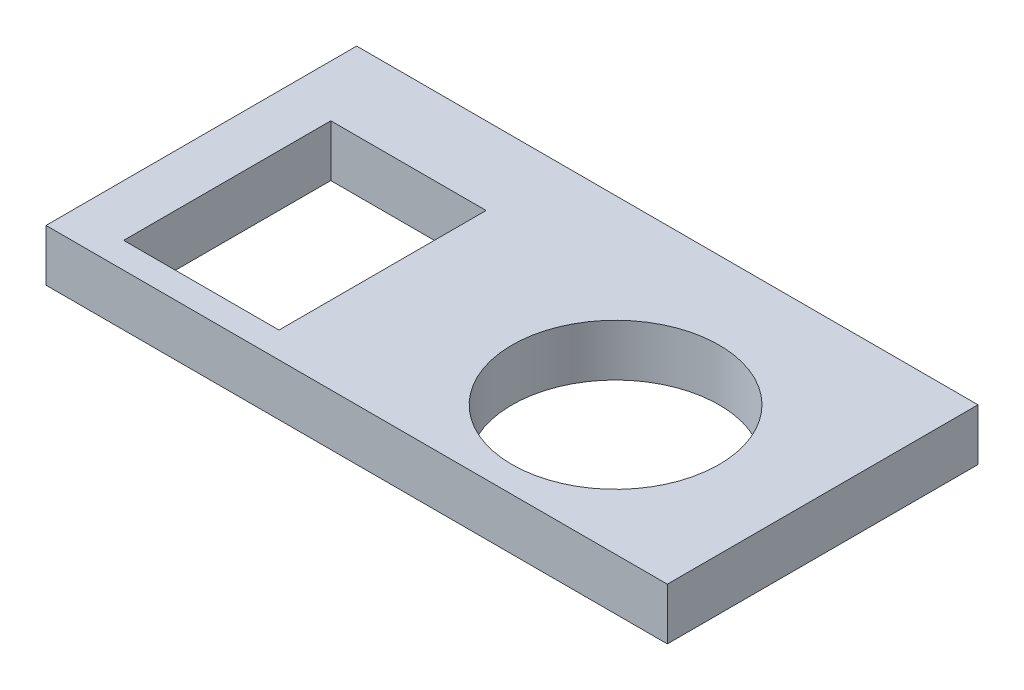
ISO-10303-21;
HEADER;
FILE_DESCRIPTION(('STEP AP214'),'2;1');
FILE_NAME('part.step','',(''),(''),'','','');
FILE_SCHEMA(('AUTOMOTIVE_DESIGN { 1 0 10303 214 1 1 1 1 }'));
ENDSEC;
DATA;
#1=APPLICATION_CONTEXT('core data for automotive mechanical design processes');
#2=APPLICATION_PROTOCOL_DEFINITION('international standard','automotive_design',2000,#1);
#3=PRODUCT_CONTEXT('',#1,'mechanical');
#4=PRODUCT('Part','Part','',(#3));
#5=PRODUCT_RELATED_PRODUCT_CATEGORY('part','',(#4));
#6=PRODUCT_DEFINITION_FORMATION('','',#4);
#7=PRODUCT_DEFINITION_CONTEXT('part definition',#1,'design');
#8=PRODUCT_DEFINITION('design','',#6,#7);
#9=PRODUCT_DEFINITION_SHAPE('','',#8);
#10=(LENGTH_UNIT() NAMED_UNIT(*) SI_UNIT(.MILLI.,.METRE.));
#11=(NAMED_UNIT(*) PLANE_ANGLE_UNIT() SI_UNIT($,.RADIAN.));
#12=(NAMED_UNIT(*) SI_UNIT($,.STERADIAN.) SOLID_ANGLE_UNIT());
#13=UNCERTAINTY_MEASURE_WITH_UNIT(LENGTH_MEASURE(1.E-05),#10,'distance_accuracy_value','');
#14=(GEOMETRIC_REPRESENTATION_CONTEXT(3) GLOBAL_UNCERTAINTY_ASSIGNED_CONTEXT((#13)) GLOBAL_UNIT_ASSIGNED_CONTEXT((#10,
#11,#12)) REPRESENTATION_CONTEXT('',''));
#15=CARTESIAN_POINT('',(0.,0.,0.));
#16=DIRECTION('',(0.,0.,1.));
#17=DIRECTION('',(1.,0.,0.));
#18=AXIS2_PLACEMENT_3D('',#15,#16,#17);
#19=CARTESIAN_POINT('',(60.,10.,-25.));
#20=DIRECTION('',(-1.,0.,0.));
#21=DIRECTION('',(0.,0.,1.));
#22=AXIS2_PLACEMENT_3D('',#19,#20,#21);
#23=PLANE('',#22);
#24=DIRECTION('',(0.,0.,-1.));
#25=VECTOR('',#24,1.);
#26=CARTESIAN_POINT('',(60.,0.,-25.));
#27=LINE('',#26,#25);
#28=CARTESIAN_POINT('',(60.,0.,25.));
#29=VERTEX_POINT('',#28);
#30=CARTESIAN_POINT('',(60.,0.,-35.));
#31=VERTEX_POINT('',#30);
#32=EDGE_CURVE('E113',#29,#31,#27,.T.);
#33=ORIENTED_EDGE('',*,*,#32,.T.);
#34=DIRECTION('',(0.,1.,0.));
#35=VECTOR('',#34,1.);
#36=CARTESIAN_POINT('',(60.,-120.415945787923,-35.));
#37=LINE('',#36,#35);
#38=CARTESIAN_POINT('',(60.,10.,-35.));
#39=VERTEX_POINT('',#38);
#40=EDGE_CURVE('E111',#31,#39,#37,.T.);
#41=ORIENTED_EDGE('',*,*,#40,.T.);
#42=DIRECTION('',(0.,0.,-1.));
#43=VECTOR('',#42,1.);
#44=CARTESIAN_POINT('',(60.,10.,-25.));
#45=LINE('',#44,#43);
#46=CARTESIAN_POINT('',(60.,10.,25.));
#47=VERTEX_POINT('',#46);
#48=EDGE_CURVE('E97',#47,#39,#45,.T.);
#49=ORIENTED_EDGE('',*,*,#48,.F.);
#50=DIRECTION('',(0.,-1.,0.));
#51=VECTOR('',#50,1.);
#52=CARTESIAN_POINT('',(60.,10.,25.));
#53=LINE('',#52,#51);
#54=EDGE_CURVE('E40',#47,#29,#53,.T.);
#55=ORIENTED_EDGE('',*,*,#54,.T.);
#56=EDGE_LOOP('',(#33,#41,#49,#55));
#57=FACE_BOUND('',#56,.T.);
#58=ADVANCED_FACE('F33',(#57),#23,.F.);
#59=CARTESIAN_POINT('',(-60.,10.,-25.));
#60=DIRECTION('',(1.,0.,0.));
#61=DIRECTION('',(0.,0.,-1.));
#62=AXIS2_PLACEMENT_3D('',#59,#60,#61);
#63=PLANE('',#62);
#64=DIRECTION('',(0.,0.,1.));
#65=VECTOR('',#64,1.);
#66=CARTESIAN_POINT('',(-60.,0.,-25.));
#67=LINE('',#66,#65);
#68=CARTESIAN_POINT('',(-60.,0.,-35.));
#69=VERTEX_POINT('',#68);
#70=CARTESIAN_POINT('',(-60.,0.,25.));
#71=VERTEX_POINT('',#70);
#72=EDGE_CURVE('E164',#69,#71,#67,.T.);
#73=ORIENTED_EDGE('',*,*,#72,.T.);
#74=DIRECTION('',(0.,-1.,0.));
#75=VECTOR('',#74,1.);
#76=CARTESIAN_POINT('',(-60.,10.,25.));
#77=LINE('',#76,#75);
#78=CARTESIAN_POINT('',(-60.,10.,25.));
#79=VERTEX_POINT('',#78);
#80=EDGE_CURVE('E11',#79,#71,#77,.T.);
#81=ORIENTED_EDGE('',*,*,#80,.F.);
#82=DIRECTION('',(0.,0.,1.));
#83=VECTOR('',#82,1.);
#84=CARTESIAN_POINT('',(-60.,10.,-25.));
#85=LINE('',#84,#83);
#86=CARTESIAN_POINT('',(-60.,10.,-35.));
#87=VERTEX_POINT('',#86);
#88=EDGE_CURVE('E107',#87,#79,#85,.T.);
#89=ORIENTED_EDGE('',*,*,#88,.F.);
#90=DIRECTION('',(0.,1.,0.));
#91=VECTOR('',#90,1.);
#92=CARTESIAN_POINT('',(-60.,-120.415945787923,-35.));
#93=LINE('',#92,#91);
#94=EDGE_CURVE('E117',#69,#87,#93,.T.);
#95=ORIENTED_EDGE('',*,*,#94,.F.);
#96=EDGE_LOOP('',(#73,#81,#89,#95));
#97=FACE_BOUND('',#96,.T.);
#98=ADVANCED_FACE('F172',(#97),#63,.F.);
#99=CARTESIAN_POINT('',(-60.,10.,25.));
#100=DIRECTION('',(0.,0.,-1.));
#101=DIRECTION('',(-1.,0.,0.));
#102=AXIS2_PLACEMENT_3D('',#99,#100,#101);
#103=PLANE('',#102);
#104=DIRECTION('',(1.,0.,0.));
#105=VECTOR('',#104,1.);
#106=CARTESIAN_POINT('',(-60.,0.,25.));
#107=LINE('',#106,#105);
#108=EDGE_CURVE('E108',#71,#29,#107,.T.);
#109=ORIENTED_EDGE('',*,*,#108,.T.);
#110=ORIENTED_EDGE('',*,*,#54,.F.);
#111=DIRECTION('',(1.,0.,0.));
#112=VECTOR('',#111,1.);
#113=CARTESIAN_POINT('',(-60.,10.,25.));
#114=LINE('',#113,#112);
#115=EDGE_CURVE('E103',#79,#47,#114,.T.);
#116=ORIENTED_EDGE('',*,*,#115,.F.);
#117=ORIENTED_EDGE('',*,*,#80,.T.);
#118=EDGE_LOOP('',(#109,#110,#116,#117));
#119=FACE_BOUND('',#118,.T.);
#120=ADVANCED_FACE('F173',(#119),#103,.F.);
#121=CARTESIAN_POINT('',(0.,10.,0.));
#122=DIRECTION('',(0.,1.,0.));
#123=DIRECTION('',(0.,0.,1.));
#124=AXIS2_PLACEMENT_3D('',#121,#122,#123);
#125=PLANE('',#124);
#126=DIRECTION('',(0.,0.,-1.));
#127=VECTOR('',#126,1.);
#128=CARTESIAN_POINT('',(-20.,10.,-20.));
#129=LINE('',#128,#127);
#130=CARTESIAN_POINT('',(-20.,10.,20.));
#131=VERTEX_POINT('',#130);
#132=CARTESIAN_POINT('',(-20.,10.,-20.));
#133=VERTEX_POINT('',#132);
#134=EDGE_CURVE('E47',#131,#133,#129,.T.);
#135=ORIENTED_EDGE('',*,*,#134,.F.);
#136=DIRECTION('',(1.,0.,0.));
#137=VECTOR('',#136,1.);
#138=CARTESIAN_POINT('',(-50.,10.,20.));
#139=LINE('',#138,#137);
#140=CARTESIAN_POINT('',(-50.,10.,20.));
#141=VERTEX_POINT('',#140);
#142=EDGE_CURVE('E131',#141,#131,#139,.T.);
#143=ORIENTED_EDGE('',*,*,#142,.F.);
#144=DIRECTION('',(0.,0.,1.));
#145=VECTOR('',#144,1.);
#146=CARTESIAN_POINT('',(-50.,10.,-20.));
#147=LINE('',#146,#145);
#148=CARTESIAN_POINT('',(-50.,10.,-20.));
#149=VERTEX_POINT('',#148);
#150=EDGE_CURVE('E143',#149,#141,#147,.T.);
#151=ORIENTED_EDGE('',*,*,#150,.F.);
#152=DIRECTION('',(-1.,0.,0.));
#153=VECTOR('',#152,1.);
#154=CARTESIAN_POINT('',(-50.,10.,-20.));
#155=LINE('',#154,#153);
#156=EDGE_CURVE('E140',#133,#149,#155,.T.);
#157=ORIENTED_EDGE('',*,*,#156,.F.);
#158=EDGE_LOOP('',(#135,#143,#151,#157));
#159=FACE_BOUND('',#158,.T.);
#160=CARTESIAN_POINT('',(25.,10.,0.));
#161=DIRECTION('',(0.,1.,0.));
#162=DIRECTION('',(0.,0.,1.));
#163=AXIS2_PLACEMENT_3D('',#160,#161,#162);
#164=CIRCLE('',#163,20.);
#165=CARTESIAN_POINT('',(25.,10.,20.));
#166=VERTEX_POINT('',#165);
#167=EDGE_CURVE('E150',#166,#166,#164,.T.);
#168=ORIENTED_EDGE('',*,*,#167,.F.);
#169=EDGE_LOOP('',(#168));
#170=FACE_BOUND('',#169,.T.);
#171=ORIENTED_EDGE('',*,*,#48,.T.);
#172=DIRECTION('',(-1.,0.,0.));
#173=VECTOR('',#172,1.);
#174=CARTESIAN_POINT('',(60.,10.,-35.));
#175=LINE('',#174,#173);
#176=EDGE_CURVE('E101',#39,#87,#175,.T.);
#177=ORIENTED_EDGE('',*,*,#176,.T.);
#178=ORIENTED_EDGE('',*,*,#88,.T.);
#179=ORIENTED_EDGE('',*,*,#115,.T.);
#180=EDGE_LOOP('',(#171,#177,#178,#179));
#181=FACE_BOUND('',#180,.T.);
#182=ADVANCED_FACE('F99',(#159,#170,#181),#125,.T.);
#183=CARTESIAN_POINT('',(0.,0.,0.));
#184=DIRECTION('',(0.,1.,0.));
#185=DIRECTION('',(0.,0.,1.));
#186=AXIS2_PLACEMENT_3D('',#183,#184,#185);
#187=PLANE('',#186);
#188=DIRECTION('',(1.,0.,0.));
#189=VECTOR('',#188,1.);
#190=CARTESIAN_POINT('',(-50.,0.,20.));
#191=LINE('',#190,#189);
#192=CARTESIAN_POINT('',(-50.,0.,20.));
#193=VERTEX_POINT('',#192);
#194=CARTESIAN_POINT('',(-20.,0.,20.));
#195=VERTEX_POINT('',#194);
#196=EDGE_CURVE('E135',#193,#195,#191,.T.);
#197=ORIENTED_EDGE('',*,*,#196,.T.);
#198=DIRECTION('',(0.,0.,-1.));
#199=VECTOR('',#198,1.);
#200=CARTESIAN_POINT('',(-20.,0.,-20.));
#201=LINE('',#200,#199);
#202=CARTESIAN_POINT('',(-20.,0.,-20.));
#203=VERTEX_POINT('',#202);
#204=EDGE_CURVE('E127',#195,#203,#201,.T.);
#205=ORIENTED_EDGE('',*,*,#204,.T.);
#206=DIRECTION('',(-1.,0.,0.));
#207=VECTOR('',#206,1.);
#208=CARTESIAN_POINT('',(-50.,0.,-20.));
#209=LINE('',#208,#207);
#210=CARTESIAN_POINT('',(-50.,0.,-20.));
#211=VERTEX_POINT('',#210);
#212=EDGE_CURVE('E130',#203,#211,#209,.T.);
#213=ORIENTED_EDGE('',*,*,#212,.T.);
#214=DIRECTION('',(0.,0.,1.));
#215=VECTOR('',#214,1.);
#216=CARTESIAN_POINT('',(-50.,0.,-20.));
#217=LINE('',#216,#215);
#218=EDGE_CURVE('E55',#211,#193,#217,.T.);
#219=ORIENTED_EDGE('',*,*,#218,.T.);
#220=EDGE_LOOP('',(#197,#205,#213,#219));
#221=FACE_BOUND('',#220,.T.);
#222=CARTESIAN_POINT('',(25.,0.,0.));
#223=DIRECTION('',(0.,1.,0.));
#224=DIRECTION('',(0.,0.,1.));
#225=AXIS2_PLACEMENT_3D('',#222,#223,#224);
#226=CIRCLE('',#225,20.);
#227=CARTESIAN_POINT('',(25.,0.,20.));
#228=VERTEX_POINT('',#227);
#229=EDGE_CURVE('E156',#228,#228,#226,.T.);
#230=ORIENTED_EDGE('',*,*,#229,.T.);
#231=EDGE_LOOP('',(#230));
#232=FACE_BOUND('',#231,.T.);
#233=ORIENTED_EDGE('',*,*,#32,.F.);
#234=ORIENTED_EDGE('',*,*,#108,.F.);
#235=ORIENTED_EDGE('',*,*,#72,.F.);
#236=DIRECTION('',(1.,0.,0.));
#237=VECTOR('',#236,1.);
#238=CARTESIAN_POINT('',(60.,0.,-35.));
#239=LINE('',#238,#237);
#240=EDGE_CURVE('E124',#69,#31,#239,.T.);
#241=ORIENTED_EDGE('',*,*,#240,.T.);
#242=EDGE_LOOP('',(#233,#234,#235,#241));
#243=FACE_BOUND('',#242,.T.);
#244=ADVANCED_FACE('F169',(#221,#232,#243),#187,.F.);
#245=CARTESIAN_POINT('',(25.,0.,0.));
#246=DIRECTION('',(0.,1.,0.));
#247=DIRECTION('',(0.,0.,1.));
#248=AXIS2_PLACEMENT_3D('',#245,#246,#247);
#249=CYLINDRICAL_SURFACE('',#248,20.);
#250=ORIENTED_EDGE('',*,*,#229,.F.);
#251=EDGE_LOOP('',(#250));
#252=FACE_BOUND('',#251,.T.);
#253=ORIENTED_EDGE('',*,*,#167,.T.);
#254=EDGE_LOOP('',(#253));
#255=FACE_BOUND('',#254,.T.);
#256=ADVANCED_FACE('F208',(#252,#255),#249,.F.);
#257=CARTESIAN_POINT('',(-20.,0.,-20.));
#258=DIRECTION('',(1.,0.,0.));
#259=DIRECTION('',(0.,0.,-1.));
#260=AXIS2_PLACEMENT_3D('',#257,#258,#259);
#261=PLANE('',#260);
#262=ORIENTED_EDGE('',*,*,#134,.T.);
#263=DIRECTION('',(0.,1.,0.));
#264=VECTOR('',#263,1.);
#265=CARTESIAN_POINT('',(-20.,0.,-20.));
#266=LINE('',#265,#264);
#267=EDGE_CURVE('E138',#203,#133,#266,.T.);
#268=ORIENTED_EDGE('',*,*,#267,.F.);
#269=ORIENTED_EDGE('',*,*,#204,.F.);
#270=DIRECTION('',(0.,1.,0.));
#271=VECTOR('',#270,1.);
#272=CARTESIAN_POINT('',(-20.,0.,20.));
#273=LINE('',#272,#271);
#274=EDGE_CURVE('E148',#195,#131,#273,.T.);
#275=ORIENTED_EDGE('',*,*,#274,.T.);
#276=EDGE_LOOP('',(#262,#268,#269,#275));
#277=FACE_BOUND('',#276,.T.);
#278=ADVANCED_FACE('F241',(#277),#261,.F.);
#279=CARTESIAN_POINT('',(-50.,0.,20.));
#280=DIRECTION('',(0.,0.,1.));
#281=DIRECTION('',(1.,0.,0.));
#282=AXIS2_PLACEMENT_3D('',#279,#280,#281);
#283=PLANE('',#282);
#284=ORIENTED_EDGE('',*,*,#142,.T.);
#285=ORIENTED_EDGE('',*,*,#274,.F.);
#286=ORIENTED_EDGE('',*,*,#196,.F.);
#287=DIRECTION('',(0.,1.,0.));
#288=VECTOR('',#287,1.);
#289=CARTESIAN_POINT('',(-50.,0.,20.));
#290=LINE('',#289,#288);
#291=EDGE_CURVE('E151',#193,#141,#290,.T.);
#292=ORIENTED_EDGE('',*,*,#291,.T.);
#293=EDGE_LOOP('',(#284,#285,#286,#292));
#294=FACE_BOUND('',#293,.T.);
#295=ADVANCED_FACE('F234',(#294),#283,.F.);
#296=CARTESIAN_POINT('',(-50.,0.,-20.));
#297=DIRECTION('',(-1.,0.,0.));
#298=DIRECTION('',(0.,0.,1.));
#299=AXIS2_PLACEMENT_3D('',#296,#297,#298);
#300=PLANE('',#299);
#301=ORIENTED_EDGE('',*,*,#150,.T.);
#302=ORIENTED_EDGE('',*,*,#291,.F.);
#303=ORIENTED_EDGE('',*,*,#218,.F.);
#304=DIRECTION('',(0.,1.,0.));
#305=VECTOR('',#304,1.);
#306=CARTESIAN_POINT('',(-50.,0.,-20.));
#307=LINE('',#306,#305);
#308=EDGE_CURVE('E153',#211,#149,#307,.T.);
#309=ORIENTED_EDGE('',*,*,#308,.T.);
#310=EDGE_LOOP('',(#301,#302,#303,#309));
#311=FACE_BOUND('',#310,.T.);
#312=ADVANCED_FACE('F226',(#311),#300,.F.);
#313=CARTESIAN_POINT('',(-50.,0.,-20.));
#314=DIRECTION('',(0.,0.,-1.));
#315=DIRECTION('',(-1.,0.,0.));
#316=AXIS2_PLACEMENT_3D('',#313,#314,#315);
#317=PLANE('',#316);
#318=ORIENTED_EDGE('',*,*,#156,.T.);
#319=ORIENTED_EDGE('',*,*,#308,.F.);
#320=ORIENTED_EDGE('',*,*,#212,.F.);
#321=ORIENTED_EDGE('',*,*,#267,.T.);
#322=EDGE_LOOP('',(#318,#319,#320,#321));
#323=FACE_BOUND('',#322,.T.);
#324=ADVANCED_FACE('F218',(#323),#317,.F.);
#325=CARTESIAN_POINT('',(60.,-120.415945787923,-35.));
#326=DIRECTION('',(0.,0.,-1.));
#327=DIRECTION('',(-1.,0.,0.));
#328=AXIS2_PLACEMENT_3D('',#325,#326,#327);
#329=PLANE('',#328);
#330=ORIENTED_EDGE('',*,*,#240,.F.);
#331=ORIENTED_EDGE('',*,*,#94,.T.);
#332=ORIENTED_EDGE('',*,*,#176,.F.);
#333=ORIENTED_EDGE('',*,*,#40,.F.);
#334=EDGE_LOOP('',(#330,#331,#332,#333));
#335=FACE_BOUND('',#334,.T.);
#336=ADVANCED_FACE('F120',(#335),#329,.T.);
#337=CLOSED_SHELL('',(#58,#98,#120,#182,#244,#256,#278,#295,#312,#324,#336));
#338=MANIFOLD_SOLID_BREP('B2',#337);
#339=ADVANCED_BREP_SHAPE_REPRESENTATION('',(#18,#338),#14);
#340=SHAPE_DEFINITION_REPRESENTATION(#9,#339);
ENDSEC;
END-ISO-10303-21;
